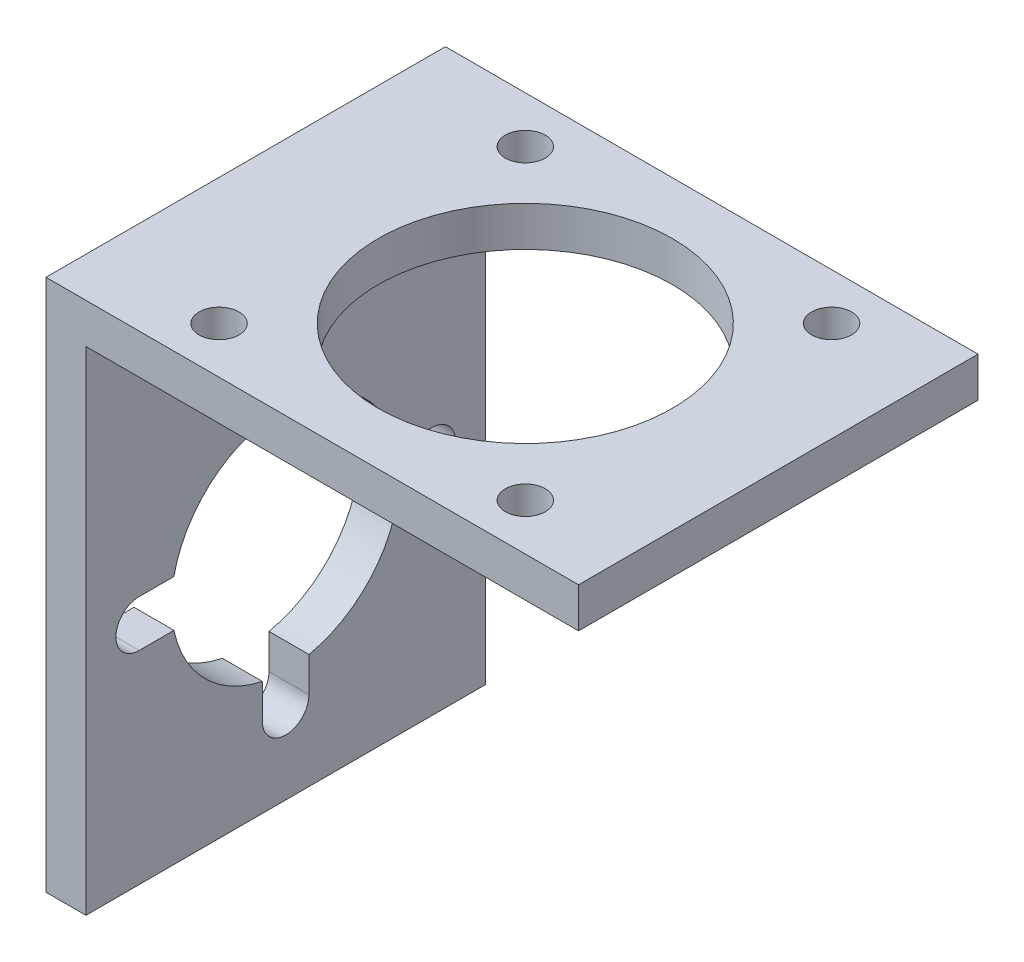
ISO-10303-21;
HEADER;
FILE_DESCRIPTION(('STEP AP214'),'2;1');
FILE_NAME('part.step','',(''),(''),'','','');
FILE_SCHEMA(('AUTOMOTIVE_DESIGN { 1 0 10303 214 1 1 1 1 }'));
ENDSEC;
DATA;
#1=APPLICATION_CONTEXT('core data for automotive mechanical design processes');
#2=APPLICATION_PROTOCOL_DEFINITION('international standard','automotive_design',2000,#1);
#3=PRODUCT_CONTEXT('',#1,'mechanical');
#4=PRODUCT('Part','Part','',(#3));
#5=PRODUCT_RELATED_PRODUCT_CATEGORY('part','',(#4));
#6=PRODUCT_DEFINITION_FORMATION('','',#4);
#7=PRODUCT_DEFINITION_CONTEXT('part definition',#1,'design');
#8=PRODUCT_DEFINITION('design','',#6,#7);
#9=PRODUCT_DEFINITION_SHAPE('','',#8);
#10=(LENGTH_UNIT() NAMED_UNIT(*) SI_UNIT(.MILLI.,.METRE.));
#11=(NAMED_UNIT(*) PLANE_ANGLE_UNIT() SI_UNIT($,.RADIAN.));
#12=(NAMED_UNIT(*) SI_UNIT($,.STERADIAN.) SOLID_ANGLE_UNIT());
#13=UNCERTAINTY_MEASURE_WITH_UNIT(LENGTH_MEASURE(1.E-05),#10,'distance_accuracy_value','');
#14=(GEOMETRIC_REPRESENTATION_CONTEXT(3) GLOBAL_UNCERTAINTY_ASSIGNED_CONTEXT((#13)) GLOBAL_UNIT_ASSIGNED_CONTEXT((#10,
#11,#12)) REPRESENTATION_CONTEXT('',''));
#15=CARTESIAN_POINT('',(0.,0.,0.));
#16=DIRECTION('',(0.,0.,1.));
#17=DIRECTION('',(1.,0.,0.));
#18=AXIS2_PLACEMENT_3D('',#15,#16,#17);
#19=CARTESIAN_POINT('',(3.,-3.,30.));
#20=DIRECTION('',(0.,1.,0.));
#21=DIRECTION('',(0.,0.,1.));
#22=AXIS2_PLACEMENT_3D('',#19,#20,#21);
#23=PLANE('',#22);
#24=CARTESIAN_POINT('',(9.50000000000012,-3.,26.5021834883641));
#25=DIRECTION('',(0.,-1.,0.));
#26=DIRECTION('',(0.,0.,-1.));
#27=AXIS2_PLACEMENT_3D('',#24,#25,#26);
#28=CIRCLE('',#27,1.5);
#29=CARTESIAN_POINT('',(9.50000000000012,-3.,25.0021834883641));
#30=VERTEX_POINT('',#29);
#31=EDGE_CURVE('E401',#30,#30,#28,.T.);
#32=ORIENTED_EDGE('',*,*,#31,.F.);
#33=EDGE_LOOP('',(#32));
#34=FACE_BOUND('',#33,.T.);
#35=CARTESIAN_POINT('',(9.49781651163593,-3.,3.49999999999975));
#36=DIRECTION('',(0.,-1.,0.));
#37=DIRECTION('',(0.,0.,-1.));
#38=AXIS2_PLACEMENT_3D('',#35,#36,#37);
#39=CIRCLE('',#38,1.5);
#40=CARTESIAN_POINT('',(9.49781651163593,-3.,1.99999999999976));
#41=VERTEX_POINT('',#40);
#42=EDGE_CURVE('E395',#41,#41,#39,.T.);
#43=ORIENTED_EDGE('',*,*,#42,.F.);
#44=EDGE_LOOP('',(#43));
#45=FACE_BOUND('',#44,.T.);
#46=CARTESIAN_POINT('',(32.5000000000003,-3.,3.49781651163567));
#47=DIRECTION('',(0.,-1.,0.));
#48=DIRECTION('',(0.,0.,-1.));
#49=AXIS2_PLACEMENT_3D('',#46,#47,#48);
#50=CIRCLE('',#49,1.49999999999999);
#51=CARTESIAN_POINT('',(32.5000000000003,-3.,1.99781651163568));
#52=VERTEX_POINT('',#51);
#53=EDGE_CURVE('E389',#52,#52,#50,.T.);
#54=ORIENTED_EDGE('',*,*,#53,.F.);
#55=EDGE_LOOP('',(#54));
#56=FACE_BOUND('',#55,.T.);
#57=CARTESIAN_POINT('',(32.5021834883643,-3.,26.5));
#58=DIRECTION('',(0.,-1.,0.));
#59=DIRECTION('',(0.,0.,-1.));
#60=AXIS2_PLACEMENT_3D('',#57,#58,#59);
#61=CIRCLE('',#60,1.49999999999999);
#62=CARTESIAN_POINT('',(32.5021834883643,-3.,25.));
#63=VERTEX_POINT('',#62);
#64=EDGE_CURVE('E383',#63,#63,#61,.T.);
#65=ORIENTED_EDGE('',*,*,#64,.F.);
#66=EDGE_LOOP('',(#65));
#67=FACE_BOUND('',#66,.T.);
#68=DIRECTION('',(1.,0.,0.));
#69=VECTOR('',#68,1.);
#70=CARTESIAN_POINT('',(3.,-3.,0.));
#71=LINE('',#70,#69);
#72=CARTESIAN_POINT('',(3.,-3.,0.));
#73=VERTEX_POINT('',#72);
#74=CARTESIAN_POINT('',(40.,-3.,0.));
#75=VERTEX_POINT('',#74);
#76=EDGE_CURVE('E279',#73,#75,#71,.T.);
#77=ORIENTED_EDGE('',*,*,#76,.T.);
#78=DIRECTION('',(0.,0.,-1.));
#79=VECTOR('',#78,1.);
#80=CARTESIAN_POINT('',(40.,-3.,30.));
#81=LINE('',#80,#79);
#82=CARTESIAN_POINT('',(40.,-3.,30.));
#83=VERTEX_POINT('',#82);
#84=EDGE_CURVE('E286',#83,#75,#81,.T.);
#85=ORIENTED_EDGE('',*,*,#84,.F.);
#86=DIRECTION('',(1.,0.,0.));
#87=VECTOR('',#86,1.);
#88=CARTESIAN_POINT('',(3.,-3.,30.));
#89=LINE('',#88,#87);
#90=CARTESIAN_POINT('',(3.,-3.,30.));
#91=VERTEX_POINT('',#90);
#92=EDGE_CURVE('E278',#91,#83,#89,.T.);
#93=ORIENTED_EDGE('',*,*,#92,.F.);
#94=DIRECTION('',(0.,0.,-1.));
#95=VECTOR('',#94,1.);
#96=CARTESIAN_POINT('',(3.,-3.,30.));
#97=LINE('',#96,#95);
#98=EDGE_CURVE('E290',#91,#73,#97,.T.);
#99=ORIENTED_EDGE('',*,*,#98,.T.);
#100=EDGE_LOOP('',(#77,#85,#93,#99));
#101=FACE_BOUND('',#100,.T.);
#102=CARTESIAN_POINT('',(21.,-3.,15.));
#103=DIRECTION('',(0.,-1.,0.));
#104=DIRECTION('',(0.,0.,-1.));
#105=AXIS2_PLACEMENT_3D('',#102,#103,#104);
#106=CIRCLE('',#105,11.05);
#107=CARTESIAN_POINT('',(21.,-3.,3.94999999999998));
#108=VERTEX_POINT('',#107);
#109=EDGE_CURVE('E375',#108,#108,#106,.T.);
#110=ORIENTED_EDGE('',*,*,#109,.F.);
#111=EDGE_LOOP('',(#110));
#112=FACE_BOUND('',#111,.T.);
#113=ADVANCED_FACE('F36',(#34,#45,#56,#67,#101,#112),#23,.F.);
#114=CARTESIAN_POINT('',(0.,-40.,0.));
#115=DIRECTION('',(0.,-1.,0.));
#116=DIRECTION('',(0.,0.,-1.));
#117=AXIS2_PLACEMENT_3D('',#114,#115,#116);
#118=PLANE('',#117);
#119=DIRECTION('',(0.,0.,-1.));
#120=VECTOR('',#119,1.);
#121=CARTESIAN_POINT('',(3.00000000000001,-40.,30.));
#122=LINE('',#121,#120);
#123=CARTESIAN_POINT('',(3.00000000000001,-40.,30.));
#124=VERTEX_POINT('',#123);
#125=CARTESIAN_POINT('',(3.00000000000001,-40.,0.));
#126=VERTEX_POINT('',#125);
#127=EDGE_CURVE('E282',#124,#126,#122,.T.);
#128=ORIENTED_EDGE('',*,*,#127,.F.);
#129=DIRECTION('',(1.,0.,0.));
#130=VECTOR('',#129,1.);
#131=CARTESIAN_POINT('',(0.,-40.,30.));
#132=LINE('',#131,#130);
#133=CARTESIAN_POINT('',(0.,-40.,30.));
#134=VERTEX_POINT('',#133);
#135=EDGE_CURVE('E289',#134,#124,#132,.T.);
#136=ORIENTED_EDGE('',*,*,#135,.F.);
#137=DIRECTION('',(0.,0.,1.));
#138=VECTOR('',#137,1.);
#139=CARTESIAN_POINT('',(0.,-40.,0.));
#140=LINE('',#139,#138);
#141=CARTESIAN_POINT('',(0.,-40.,0.));
#142=VERTEX_POINT('',#141);
#143=EDGE_CURVE('E315',#142,#134,#140,.T.);
#144=ORIENTED_EDGE('',*,*,#143,.F.);
#145=DIRECTION('',(1.,0.,0.));
#146=VECTOR('',#145,1.);
#147=CARTESIAN_POINT('',(0.,-40.,0.));
#148=LINE('',#147,#146);
#149=EDGE_CURVE('E293',#142,#126,#148,.T.);
#150=ORIENTED_EDGE('',*,*,#149,.T.);
#151=EDGE_LOOP('',(#128,#136,#144,#150));
#152=FACE_BOUND('',#151,.T.);
#153=ADVANCED_FACE('F38',(#152),#118,.T.);
#154=CARTESIAN_POINT('',(0.,0.,0.));
#155=DIRECTION('',(-1.,0.,0.));
#156=DIRECTION('',(0.,-1.,0.));
#157=AXIS2_PLACEMENT_3D('',#154,#155,#156);
#158=PLANE('',#157);
#159=CARTESIAN_POINT('',(0.,-12.02,14.9999999999999));
#160=DIRECTION('',(-1.,0.,0.));
#161=DIRECTION('',(0.,-1.,0.));
#162=AXIS2_PLACEMENT_3D('',#159,#160,#161);
#163=CIRCLE('',#162,1.75);
#164=CARTESIAN_POINT('',(0.,-12.02,16.7499999999999));
#165=VERTEX_POINT('',#164);
#166=CARTESIAN_POINT('',(0.,-12.02,13.2499999999999));
#167=VERTEX_POINT('',#166);
#168=EDGE_CURVE('E51',#165,#167,#163,.T.);
#169=ORIENTED_EDGE('',*,*,#168,.F.);
#170=DIRECTION('',(0.,1.,0.));
#171=VECTOR('',#170,1.);
#172=CARTESIAN_POINT('',(0.,-14.6305780890457,16.7499999999999));
#173=LINE('',#172,#171);
#174=CARTESIAN_POINT('',(0.,-14.6305780890457,16.7499999999999));
#175=VERTEX_POINT('',#174);
#176=EDGE_CURVE('E243',#175,#165,#173,.T.);
#177=ORIENTED_EDGE('',*,*,#176,.F.);
#178=CARTESIAN_POINT('',(0.,-23.02,15.));
#179=DIRECTION('',(-1.,0.,0.));
#180=DIRECTION('',(0.,-1.,0.));
#181=AXIS2_PLACEMENT_3D('',#178,#179,#180);
#182=CIRCLE('',#181,8.57);
#183=CARTESIAN_POINT('',(0.,-21.27,23.3894219109543));
#184=VERTEX_POINT('',#183);
#185=EDGE_CURVE('E240',#184,#175,#182,.T.);
#186=ORIENTED_EDGE('',*,*,#185,.F.);
#187=DIRECTION('',(0.,0.,-1.));
#188=VECTOR('',#187,1.);
#189=CARTESIAN_POINT('',(0.,-21.27,26.));
#190=LINE('',#189,#188);
#191=CARTESIAN_POINT('',(0.,-21.27,26.));
#192=VERTEX_POINT('',#191);
#193=EDGE_CURVE('E237',#192,#184,#190,.T.);
#194=ORIENTED_EDGE('',*,*,#193,.F.);
#195=CARTESIAN_POINT('',(0.,-23.02,26.));
#196=DIRECTION('',(-1.,0.,0.));
#197=DIRECTION('',(0.,-1.,0.));
#198=AXIS2_PLACEMENT_3D('',#195,#196,#197);
#199=CIRCLE('',#198,1.75);
#200=CARTESIAN_POINT('',(0.,-24.77,26.));
#201=VERTEX_POINT('',#200);
#202=EDGE_CURVE('E234',#201,#192,#199,.T.);
#203=ORIENTED_EDGE('',*,*,#202,.F.);
#204=DIRECTION('',(0.,0.,1.));
#205=VECTOR('',#204,1.);
#206=CARTESIAN_POINT('',(0.,-24.77,23.3894219109543));
#207=LINE('',#206,#205);
#208=CARTESIAN_POINT('',(0.,-24.77,23.3894219109543));
#209=VERTEX_POINT('',#208);
#210=EDGE_CURVE('E231',#209,#201,#207,.T.);
#211=ORIENTED_EDGE('',*,*,#210,.F.);
#212=CARTESIAN_POINT('',(0.,-23.02,15.));
#213=DIRECTION('',(-1.,0.,0.));
#214=DIRECTION('',(0.,-1.,0.));
#215=AXIS2_PLACEMENT_3D('',#212,#213,#214);
#216=CIRCLE('',#215,8.57);
#217=CARTESIAN_POINT('',(0.,-31.4094219109543,16.75));
#218=VERTEX_POINT('',#217);
#219=EDGE_CURVE('E228',#218,#209,#216,.T.);
#220=ORIENTED_EDGE('',*,*,#219,.F.);
#221=DIRECTION('',(0.,1.,0.));
#222=VECTOR('',#221,1.);
#223=CARTESIAN_POINT('',(0.,-34.02,16.75));
#224=LINE('',#223,#222);
#225=CARTESIAN_POINT('',(0.,-34.02,16.75));
#226=VERTEX_POINT('',#225);
#227=EDGE_CURVE('E225',#226,#218,#224,.T.);
#228=ORIENTED_EDGE('',*,*,#227,.F.);
#229=CARTESIAN_POINT('',(0.,-34.02,15.));
#230=DIRECTION('',(-1.,0.,0.));
#231=DIRECTION('',(0.,-1.,0.));
#232=AXIS2_PLACEMENT_3D('',#229,#230,#231);
#233=CIRCLE('',#232,1.75000000000002);
#234=CARTESIAN_POINT('',(0.,-34.02,13.25));
#235=VERTEX_POINT('',#234);
#236=EDGE_CURVE('E222',#235,#226,#233,.T.);
#237=ORIENTED_EDGE('',*,*,#236,.F.);
#238=DIRECTION('',(0.,-1.,0.));
#239=VECTOR('',#238,1.);
#240=CARTESIAN_POINT('',(0.,-31.4094219109543,13.2499999999999));
#241=LINE('',#240,#239);
#242=CARTESIAN_POINT('',(0.,-31.4094219109543,13.2499999999999));
#243=VERTEX_POINT('',#242);
#244=EDGE_CURVE('E219',#243,#235,#241,.T.);
#245=ORIENTED_EDGE('',*,*,#244,.F.);
#246=CARTESIAN_POINT('',(0.,-23.02,15.));
#247=DIRECTION('',(-1.,0.,0.));
#248=DIRECTION('',(0.,-1.,0.));
#249=AXIS2_PLACEMENT_3D('',#246,#247,#248);
#250=CIRCLE('',#249,8.57);
#251=CARTESIAN_POINT('',(0.,-24.7700000000001,6.61057808904573));
#252=VERTEX_POINT('',#251);
#253=EDGE_CURVE('E216',#252,#243,#250,.T.);
#254=ORIENTED_EDGE('',*,*,#253,.F.);
#255=DIRECTION('',(0.,0.,1.));
#256=VECTOR('',#255,1.);
#257=CARTESIAN_POINT('',(0.,-24.7700000000001,4.00000000000001));
#258=LINE('',#257,#256);
#259=CARTESIAN_POINT('',(0.,-24.7700000000001,4.00000000000001));
#260=VERTEX_POINT('',#259);
#261=EDGE_CURVE('E213',#260,#252,#258,.T.);
#262=ORIENTED_EDGE('',*,*,#261,.F.);
#263=CARTESIAN_POINT('',(0.,-23.0200000000001,4.00000000000001));
#264=DIRECTION('',(-1.,0.,0.));
#265=DIRECTION('',(0.,-1.,0.));
#266=AXIS2_PLACEMENT_3D('',#263,#264,#265);
#267=CIRCLE('',#266,1.75000000000004);
#268=CARTESIAN_POINT('',(0.,-21.2700000000001,4.00000000000001));
#269=VERTEX_POINT('',#268);
#270=EDGE_CURVE('E207',#269,#260,#267,.T.);
#271=ORIENTED_EDGE('',*,*,#270,.F.);
#272=DIRECTION('',(0.,0.,-1.));
#273=VECTOR('',#272,1.);
#274=CARTESIAN_POINT('',(0.,-21.27,6.61057808904571));
#275=LINE('',#274,#273);
#276=CARTESIAN_POINT('',(0.,-21.27,6.61057808904571));
#277=VERTEX_POINT('',#276);
#278=EDGE_CURVE('E205',#277,#269,#275,.T.);
#279=ORIENTED_EDGE('',*,*,#278,.F.);
#280=CARTESIAN_POINT('',(0.,-23.02,15.));
#281=DIRECTION('',(-1.,0.,0.));
#282=DIRECTION('',(0.,-1.,0.));
#283=AXIS2_PLACEMENT_3D('',#280,#281,#282);
#284=CIRCLE('',#283,8.57);
#285=CARTESIAN_POINT('',(0.,-14.6305780890457,13.2499999999999));
#286=VERTEX_POINT('',#285);
#287=EDGE_CURVE('E188',#286,#277,#284,.T.);
#288=ORIENTED_EDGE('',*,*,#287,.F.);
#289=DIRECTION('',(0.,-1.,0.));
#290=VECTOR('',#289,1.);
#291=CARTESIAN_POINT('',(0.,-12.02,13.2499999999999));
#292=LINE('',#291,#290);
#293=EDGE_CURVE('E197',#167,#286,#292,.T.);
#294=ORIENTED_EDGE('',*,*,#293,.F.);
#295=EDGE_LOOP('',(#169,#177,#186,#194,#203,#211,#220,#228,#237,#245,#254,#262,#271,#279,#288,#294));
#296=FACE_BOUND('',#295,.T.);
#297=DIRECTION('',(0.,-1.,0.));
#298=VECTOR('',#297,1.);
#299=CARTESIAN_POINT('',(0.,0.,30.));
#300=LINE('',#299,#298);
#301=CARTESIAN_POINT('',(0.,0.,30.));
#302=VERTEX_POINT('',#301);
#303=EDGE_CURVE('E297',#302,#134,#300,.T.);
#304=ORIENTED_EDGE('',*,*,#303,.F.);
#305=DIRECTION('',(0.,0.,1.));
#306=VECTOR('',#305,1.);
#307=CARTESIAN_POINT('',(0.,0.,0.));
#308=LINE('',#307,#306);
#309=CARTESIAN_POINT('',(0.,0.,0.));
#310=VERTEX_POINT('',#309);
#311=EDGE_CURVE('E318',#310,#302,#308,.T.);
#312=ORIENTED_EDGE('',*,*,#311,.F.);
#313=DIRECTION('',(0.,-1.,0.));
#314=VECTOR('',#313,1.);
#315=CARTESIAN_POINT('',(0.,0.,0.));
#316=LINE('',#315,#314);
#317=EDGE_CURVE('E302',#310,#142,#316,.T.);
#318=ORIENTED_EDGE('',*,*,#317,.T.);
#319=ORIENTED_EDGE('',*,*,#143,.T.);
#320=EDGE_LOOP('',(#304,#312,#318,#319));
#321=FACE_BOUND('',#320,.T.);
#322=ADVANCED_FACE('F201',(#296,#321),#158,.T.);
#323=CARTESIAN_POINT('',(40.,0.,0.));
#324=DIRECTION('',(0.,1.,0.));
#325=DIRECTION('',(0.,0.,1.));
#326=AXIS2_PLACEMENT_3D('',#323,#324,#325);
#327=PLANE('',#326);
#328=CARTESIAN_POINT('',(9.50000000000012,0.,26.5021834883641));
#329=DIRECTION('',(0.,-1.,0.));
#330=DIRECTION('',(0.,0.,-1.));
#331=AXIS2_PLACEMENT_3D('',#328,#329,#330);
#332=CIRCLE('',#331,1.5);
#333=CARTESIAN_POINT('',(9.50000000000012,0.,25.0021834883641));
#334=VERTEX_POINT('',#333);
#335=EDGE_CURVE('E398',#334,#334,#332,.T.);
#336=ORIENTED_EDGE('',*,*,#335,.T.);
#337=EDGE_LOOP('',(#336));
#338=FACE_BOUND('',#337,.T.);
#339=CARTESIAN_POINT('',(9.49781651163593,0.,3.49999999999975));
#340=DIRECTION('',(0.,-1.,0.));
#341=DIRECTION('',(0.,0.,-1.));
#342=AXIS2_PLACEMENT_3D('',#339,#340,#341);
#343=CIRCLE('',#342,1.5);
#344=CARTESIAN_POINT('',(9.49781651163593,0.,1.99999999999976));
#345=VERTEX_POINT('',#344);
#346=EDGE_CURVE('E392',#345,#345,#343,.T.);
#347=ORIENTED_EDGE('',*,*,#346,.T.);
#348=EDGE_LOOP('',(#347));
#349=FACE_BOUND('',#348,.T.);
#350=CARTESIAN_POINT('',(32.5000000000003,0.,3.49781651163567));
#351=DIRECTION('',(0.,-1.,0.));
#352=DIRECTION('',(0.,0.,-1.));
#353=AXIS2_PLACEMENT_3D('',#350,#351,#352);
#354=CIRCLE('',#353,1.49999999999999);
#355=CARTESIAN_POINT('',(32.5000000000003,0.,1.99781651163568));
#356=VERTEX_POINT('',#355);
#357=EDGE_CURVE('E386',#356,#356,#354,.T.);
#358=ORIENTED_EDGE('',*,*,#357,.T.);
#359=EDGE_LOOP('',(#358));
#360=FACE_BOUND('',#359,.T.);
#361=CARTESIAN_POINT('',(32.5021834883643,0.,26.5));
#362=DIRECTION('',(0.,-1.,0.));
#363=DIRECTION('',(0.,0.,-1.));
#364=AXIS2_PLACEMENT_3D('',#361,#362,#363);
#365=CIRCLE('',#364,1.49999999999999);
#366=CARTESIAN_POINT('',(32.5021834883643,0.,25.));
#367=VERTEX_POINT('',#366);
#368=EDGE_CURVE('E380',#367,#367,#365,.T.);
#369=ORIENTED_EDGE('',*,*,#368,.T.);
#370=EDGE_LOOP('',(#369));
#371=FACE_BOUND('',#370,.T.);
#372=CARTESIAN_POINT('',(21.,0.,15.));
#373=DIRECTION('',(0.,-1.,0.));
#374=DIRECTION('',(0.,0.,-1.));
#375=AXIS2_PLACEMENT_3D('',#372,#373,#374);
#376=CIRCLE('',#375,11.05);
#377=CARTESIAN_POINT('',(21.,0.,3.94999999999998));
#378=VERTEX_POINT('',#377);
#379=EDGE_CURVE('E373',#378,#378,#376,.T.);
#380=ORIENTED_EDGE('',*,*,#379,.T.);
#381=EDGE_LOOP('',(#380));
#382=FACE_BOUND('',#381,.T.);
#383=DIRECTION('',(-1.,0.,0.));
#384=VECTOR('',#383,1.);
#385=CARTESIAN_POINT('',(40.,0.,30.));
#386=LINE('',#385,#384);
#387=CARTESIAN_POINT('',(40.,0.,30.));
#388=VERTEX_POINT('',#387);
#389=EDGE_CURVE('E310',#388,#302,#386,.T.);
#390=ORIENTED_EDGE('',*,*,#389,.F.);
#391=DIRECTION('',(0.,0.,1.));
#392=VECTOR('',#391,1.);
#393=CARTESIAN_POINT('',(40.,0.,0.));
#394=LINE('',#393,#392);
#395=CARTESIAN_POINT('',(40.,0.,0.));
#396=VERTEX_POINT('',#395);
#397=EDGE_CURVE('E305',#396,#388,#394,.T.);
#398=ORIENTED_EDGE('',*,*,#397,.F.);
#399=DIRECTION('',(-1.,0.,0.));
#400=VECTOR('',#399,1.);
#401=CARTESIAN_POINT('',(40.,0.,0.));
#402=LINE('',#401,#400);
#403=EDGE_CURVE('E299',#396,#310,#402,.T.);
#404=ORIENTED_EDGE('',*,*,#403,.T.);
#405=ORIENTED_EDGE('',*,*,#311,.T.);
#406=EDGE_LOOP('',(#390,#398,#404,#405));
#407=FACE_BOUND('',#406,.T.);
#408=ADVANCED_FACE('F502',(#338,#349,#360,#371,#382,#407),#327,.T.);
#409=CARTESIAN_POINT('',(40.,-40.,0.));
#410=DIRECTION('',(1.,0.,0.));
#411=DIRECTION('',(0.,0.,-1.));
#412=AXIS2_PLACEMENT_3D('',#409,#410,#411);
#413=PLANE('',#412);
#414=ORIENTED_EDGE('',*,*,#84,.T.);
#415=DIRECTION('',(0.,1.,0.));
#416=VECTOR('',#415,1.);
#417=CARTESIAN_POINT('',(40.,-40.,0.));
#418=LINE('',#417,#416);
#419=EDGE_CURVE('E296',#75,#396,#418,.T.);
#420=ORIENTED_EDGE('',*,*,#419,.T.);
#421=ORIENTED_EDGE('',*,*,#397,.T.);
#422=DIRECTION('',(0.,1.,0.));
#423=VECTOR('',#422,1.);
#424=CARTESIAN_POINT('',(40.,-40.,30.));
#425=LINE('',#424,#423);
#426=EDGE_CURVE('E308',#83,#388,#425,.T.);
#427=ORIENTED_EDGE('',*,*,#426,.F.);
#428=EDGE_LOOP('',(#414,#420,#421,#427));
#429=FACE_BOUND('',#428,.T.);
#430=ADVANCED_FACE('F495',(#429),#413,.T.);
#431=CARTESIAN_POINT('',(0.,0.,0.));
#432=DIRECTION('',(0.,0.,1.));
#433=DIRECTION('',(1.,0.,0.));
#434=AXIS2_PLACEMENT_3D('',#431,#432,#433);
#435=PLANE('',#434);
#436=ORIENTED_EDGE('',*,*,#419,.F.);
#437=ORIENTED_EDGE('',*,*,#76,.F.);
#438=DIRECTION('',(0.,1.,0.));
#439=VECTOR('',#438,1.);
#440=CARTESIAN_POINT('',(3.00000000000001,-40.,0.));
#441=LINE('',#440,#439);
#442=EDGE_CURVE('E248',#126,#73,#441,.T.);
#443=ORIENTED_EDGE('',*,*,#442,.F.);
#444=ORIENTED_EDGE('',*,*,#149,.F.);
#445=ORIENTED_EDGE('',*,*,#317,.F.);
#446=ORIENTED_EDGE('',*,*,#403,.F.);
#447=EDGE_LOOP('',(#436,#437,#443,#444,#445,#446));
#448=FACE_BOUND('',#447,.T.);
#449=ADVANCED_FACE('F492',(#448),#435,.F.);
#450=CARTESIAN_POINT('',(0.,0.,30.));
#451=DIRECTION('',(0.,0.,1.));
#452=DIRECTION('',(1.,0.,0.));
#453=AXIS2_PLACEMENT_3D('',#450,#451,#452);
#454=PLANE('',#453);
#455=ORIENTED_EDGE('',*,*,#92,.T.);
#456=ORIENTED_EDGE('',*,*,#426,.T.);
#457=ORIENTED_EDGE('',*,*,#389,.T.);
#458=ORIENTED_EDGE('',*,*,#303,.T.);
#459=ORIENTED_EDGE('',*,*,#135,.T.);
#460=DIRECTION('',(0.,1.,0.));
#461=VECTOR('',#460,1.);
#462=CARTESIAN_POINT('',(3.00000000000001,-40.,30.));
#463=LINE('',#462,#461);
#464=EDGE_CURVE('E275',#124,#91,#463,.T.);
#465=ORIENTED_EDGE('',*,*,#464,.T.);
#466=EDGE_LOOP('',(#455,#456,#457,#458,#459,#465));
#467=FACE_BOUND('',#466,.T.);
#468=ADVANCED_FACE('F491',(#467),#454,.T.);
#469=CARTESIAN_POINT('',(3.00000000000001,-40.,30.));
#470=DIRECTION('',(-1.,0.,0.));
#471=DIRECTION('',(0.,-1.,0.));
#472=AXIS2_PLACEMENT_3D('',#469,#470,#471);
#473=PLANE('',#472);
#474=DIRECTION('',(0.,1.,0.));
#475=VECTOR('',#474,1.);
#476=CARTESIAN_POINT('',(3.00000000000001,-40.,16.7499999999999));
#477=LINE('',#476,#475);
#478=CARTESIAN_POINT('',(3.,-14.6305780890457,16.7499999999999));
#479=VERTEX_POINT('',#478);
#480=CARTESIAN_POINT('',(3.,-12.02,16.7499999999999));
#481=VERTEX_POINT('',#480);
#482=EDGE_CURVE('E44',#479,#481,#477,.T.);
#483=ORIENTED_EDGE('',*,*,#482,.T.);
#484=CARTESIAN_POINT('',(3.,-12.02,14.9999999999999));
#485=DIRECTION('',(-1.,0.,0.));
#486=DIRECTION('',(0.,-1.,0.));
#487=AXIS2_PLACEMENT_3D('',#484,#485,#486);
#488=CIRCLE('',#487,1.75);
#489=CARTESIAN_POINT('',(3.,-12.02,13.2499999999999));
#490=VERTEX_POINT('',#489);
#491=EDGE_CURVE('E11',#481,#490,#488,.T.);
#492=ORIENTED_EDGE('',*,*,#491,.T.);
#493=DIRECTION('',(0.,-1.,0.));
#494=VECTOR('',#493,1.);
#495=CARTESIAN_POINT('',(3.00000000000001,-40.,13.2499999999999));
#496=LINE('',#495,#494);
#497=CARTESIAN_POINT('',(3.,-14.6305780890457,13.2499999999999));
#498=VERTEX_POINT('',#497);
#499=EDGE_CURVE('E317',#490,#498,#496,.T.);
#500=ORIENTED_EDGE('',*,*,#499,.T.);
#501=CARTESIAN_POINT('',(3.,-23.02,15.));
#502=DIRECTION('',(-1.,0.,0.));
#503=DIRECTION('',(0.,-1.,0.));
#504=AXIS2_PLACEMENT_3D('',#501,#502,#503);
#505=CIRCLE('',#504,8.57);
#506=CARTESIAN_POINT('',(3.,-21.27,6.61057808904571));
#507=VERTEX_POINT('',#506);
#508=EDGE_CURVE('E191',#498,#507,#505,.T.);
#509=ORIENTED_EDGE('',*,*,#508,.T.);
#510=DIRECTION('',(0.,0.,-1.));
#511=VECTOR('',#510,1.);
#512=CARTESIAN_POINT('',(3.,-21.2699999999993,29.9999999999995));
#513=LINE('',#512,#511);
#514=CARTESIAN_POINT('',(3.,-21.2700000000001,4.00000000000001));
#515=VERTEX_POINT('',#514);
#516=EDGE_CURVE('E324',#507,#515,#513,.T.);
#517=ORIENTED_EDGE('',*,*,#516,.T.);
#518=CARTESIAN_POINT('',(3.,-23.0200000000001,4.00000000000001));
#519=DIRECTION('',(-1.,0.,0.));
#520=DIRECTION('',(0.,-1.,0.));
#521=AXIS2_PLACEMENT_3D('',#518,#519,#520);
#522=CIRCLE('',#521,1.75000000000004);
#523=CARTESIAN_POINT('',(3.,-24.7700000000001,4.00000000000001));
#524=VERTEX_POINT('',#523);
#525=EDGE_CURVE('E327',#515,#524,#522,.T.);
#526=ORIENTED_EDGE('',*,*,#525,.T.);
#527=DIRECTION('',(0.,0.,1.));
#528=VECTOR('',#527,1.);
#529=CARTESIAN_POINT('',(3.,-24.7700000000001,30.));
#530=LINE('',#529,#528);
#531=CARTESIAN_POINT('',(3.,-24.7700000000001,6.61057808904573));
#532=VERTEX_POINT('',#531);
#533=EDGE_CURVE('E330',#524,#532,#530,.T.);
#534=ORIENTED_EDGE('',*,*,#533,.T.);
#535=CARTESIAN_POINT('',(3.,-23.02,15.));
#536=DIRECTION('',(-1.,0.,0.));
#537=DIRECTION('',(0.,-1.,0.));
#538=AXIS2_PLACEMENT_3D('',#535,#536,#537);
#539=CIRCLE('',#538,8.57);
#540=CARTESIAN_POINT('',(3.,-31.4094219109543,13.2499999999999));
#541=VERTEX_POINT('',#540);
#542=EDGE_CURVE('E333',#532,#541,#539,.T.);
#543=ORIENTED_EDGE('',*,*,#542,.T.);
#544=DIRECTION('',(0.,-1.,0.));
#545=VECTOR('',#544,1.);
#546=CARTESIAN_POINT('',(3.00000000000001,-40.0000000000002,13.25));
#547=LINE('',#546,#545);
#548=CARTESIAN_POINT('',(3.,-34.02,13.25));
#549=VERTEX_POINT('',#548);
#550=EDGE_CURVE('E336',#541,#549,#547,.T.);
#551=ORIENTED_EDGE('',*,*,#550,.T.);
#552=CARTESIAN_POINT('',(3.,-34.02,15.));
#553=DIRECTION('',(-1.,0.,0.));
#554=DIRECTION('',(0.,-1.,0.));
#555=AXIS2_PLACEMENT_3D('',#552,#553,#554);
#556=CIRCLE('',#555,1.75000000000002);
#557=CARTESIAN_POINT('',(3.,-34.02,16.75));
#558=VERTEX_POINT('',#557);
#559=EDGE_CURVE('E339',#549,#558,#556,.T.);
#560=ORIENTED_EDGE('',*,*,#559,.T.);
#561=DIRECTION('',(0.,1.,0.));
#562=VECTOR('',#561,1.);
#563=CARTESIAN_POINT('',(3.00000000000001,-40.,16.75));
#564=LINE('',#563,#562);
#565=CARTESIAN_POINT('',(3.,-31.4094219109543,16.75));
#566=VERTEX_POINT('',#565);
#567=EDGE_CURVE('E342',#558,#566,#564,.T.);
#568=ORIENTED_EDGE('',*,*,#567,.T.);
#569=CARTESIAN_POINT('',(3.,-23.02,15.));
#570=DIRECTION('',(-1.,0.,0.));
#571=DIRECTION('',(0.,-1.,0.));
#572=AXIS2_PLACEMENT_3D('',#569,#570,#571);
#573=CIRCLE('',#572,8.57);
#574=CARTESIAN_POINT('',(3.,-24.77,23.3894219109543));
#575=VERTEX_POINT('',#574);
#576=EDGE_CURVE('E345',#566,#575,#573,.T.);
#577=ORIENTED_EDGE('',*,*,#576,.T.);
#578=DIRECTION('',(0.,0.,1.));
#579=VECTOR('',#578,1.);
#580=CARTESIAN_POINT('',(3.,-24.77,30.));
#581=LINE('',#580,#579);
#582=CARTESIAN_POINT('',(3.,-24.77,26.));
#583=VERTEX_POINT('',#582);
#584=EDGE_CURVE('E348',#575,#583,#581,.T.);
#585=ORIENTED_EDGE('',*,*,#584,.T.);
#586=CARTESIAN_POINT('',(3.,-23.02,26.));
#587=DIRECTION('',(-1.,0.,0.));
#588=DIRECTION('',(0.,-1.,0.));
#589=AXIS2_PLACEMENT_3D('',#586,#587,#588);
#590=CIRCLE('',#589,1.75);
#591=CARTESIAN_POINT('',(3.,-21.27,26.));
#592=VERTEX_POINT('',#591);
#593=EDGE_CURVE('E351',#583,#592,#590,.T.);
#594=ORIENTED_EDGE('',*,*,#593,.T.);
#595=DIRECTION('',(0.,0.,-1.));
#596=VECTOR('',#595,1.);
#597=CARTESIAN_POINT('',(3.,-21.27,30.));
#598=LINE('',#597,#596);
#599=CARTESIAN_POINT('',(3.,-21.27,23.3894219109543));
#600=VERTEX_POINT('',#599);
#601=EDGE_CURVE('E354',#592,#600,#598,.T.);
#602=ORIENTED_EDGE('',*,*,#601,.T.);
#603=CARTESIAN_POINT('',(3.,-23.02,15.));
#604=DIRECTION('',(-1.,0.,0.));
#605=DIRECTION('',(0.,-1.,0.));
#606=AXIS2_PLACEMENT_3D('',#603,#604,#605);
#607=CIRCLE('',#606,8.57);
#608=EDGE_CURVE('E357',#600,#479,#607,.T.);
#609=ORIENTED_EDGE('',*,*,#608,.T.);
#610=EDGE_LOOP('',(#483,#492,#500,#509,#517,#526,#534,#543,#551,#560,#568,#577,#585,#594,#602,#609));
#611=FACE_BOUND('',#610,.T.);
#612=ORIENTED_EDGE('',*,*,#442,.T.);
#613=ORIENTED_EDGE('',*,*,#98,.F.);
#614=ORIENTED_EDGE('',*,*,#464,.F.);
#615=ORIENTED_EDGE('',*,*,#127,.T.);
#616=EDGE_LOOP('',(#612,#613,#614,#615));
#617=FACE_BOUND('',#616,.T.);
#618=ADVANCED_FACE('F361',(#611,#617),#473,.F.);
#619=CARTESIAN_POINT('',(40.,-12.02,14.9999999999999));
#620=DIRECTION('',(-1.,0.,0.));
#621=DIRECTION('',(0.,-1.,0.));
#622=AXIS2_PLACEMENT_3D('',#619,#620,#621);
#623=CYLINDRICAL_SURFACE('',#622,1.75);
#624=DIRECTION('',(-1.,0.,0.));
#625=VECTOR('',#624,1.);
#626=CARTESIAN_POINT('',(40.,-12.02,16.7499999999999));
#627=LINE('',#626,#625);
#628=EDGE_CURVE('E246',#481,#165,#627,.T.);
#629=ORIENTED_EDGE('',*,*,#628,.T.);
#630=ORIENTED_EDGE('',*,*,#168,.T.);
#631=DIRECTION('',(-1.,0.,0.));
#632=VECTOR('',#631,1.);
#633=CARTESIAN_POINT('',(40.,-12.02,13.2499999999999));
#634=LINE('',#633,#632);
#635=EDGE_CURVE('E194',#490,#167,#634,.T.);
#636=ORIENTED_EDGE('',*,*,#635,.F.);
#637=ORIENTED_EDGE('',*,*,#491,.F.);
#638=EDGE_LOOP('',(#629,#630,#636,#637));
#639=FACE_BOUND('',#638,.T.);
#640=ADVANCED_FACE('F438',(#639),#623,.F.);
#641=CARTESIAN_POINT('',(40.,-14.6305780890457,16.7499999999999));
#642=DIRECTION('',(0.,0.,1.));
#643=DIRECTION('',(0.,-1.,0.));
#644=AXIS2_PLACEMENT_3D('',#641,#642,#643);
#645=PLANE('',#644);
#646=DIRECTION('',(-1.,0.,0.));
#647=VECTOR('',#646,1.);
#648=CARTESIAN_POINT('',(40.,-14.6305780890457,16.7499999999999));
#649=LINE('',#648,#647);
#650=EDGE_CURVE('E249',#479,#175,#649,.T.);
#651=ORIENTED_EDGE('',*,*,#650,.T.);
#652=ORIENTED_EDGE('',*,*,#176,.T.);
#653=ORIENTED_EDGE('',*,*,#628,.F.);
#654=ORIENTED_EDGE('',*,*,#482,.F.);
#655=EDGE_LOOP('',(#651,#652,#653,#654));
#656=FACE_BOUND('',#655,.T.);
#657=ADVANCED_FACE('F366',(#656),#645,.F.);
#658=CARTESIAN_POINT('',(40.,-23.02,15.));
#659=DIRECTION('',(-1.,0.,0.));
#660=DIRECTION('',(0.,-1.,0.));
#661=AXIS2_PLACEMENT_3D('',#658,#659,#660);
#662=CYLINDRICAL_SURFACE('',#661,8.57);
#663=DIRECTION('',(-1.,0.,0.));
#664=VECTOR('',#663,1.);
#665=CARTESIAN_POINT('',(40.,-21.27,23.3894219109543));
#666=LINE('',#665,#664);
#667=EDGE_CURVE('E251',#600,#184,#666,.T.);
#668=ORIENTED_EDGE('',*,*,#667,.T.);
#669=ORIENTED_EDGE('',*,*,#185,.T.);
#670=ORIENTED_EDGE('',*,*,#650,.F.);
#671=ORIENTED_EDGE('',*,*,#608,.F.);
#672=EDGE_LOOP('',(#668,#669,#670,#671));
#673=FACE_BOUND('',#672,.T.);
#674=ADVANCED_FACE('F368',(#673),#662,.F.);
#675=CARTESIAN_POINT('',(40.,-21.27,26.));
#676=DIRECTION('',(0.,1.,0.));
#677=DIRECTION('',(-1.,0.,0.));
#678=AXIS2_PLACEMENT_3D('',#675,#676,#677);
#679=PLANE('',#678);
#680=DIRECTION('',(-1.,0.,0.));
#681=VECTOR('',#680,1.);
#682=CARTESIAN_POINT('',(40.,-21.27,26.));
#683=LINE('',#682,#681);
#684=EDGE_CURVE('E253',#592,#192,#683,.T.);
#685=ORIENTED_EDGE('',*,*,#684,.T.);
#686=ORIENTED_EDGE('',*,*,#193,.T.);
#687=ORIENTED_EDGE('',*,*,#667,.F.);
#688=ORIENTED_EDGE('',*,*,#601,.F.);
#689=EDGE_LOOP('',(#685,#686,#687,#688));
#690=FACE_BOUND('',#689,.T.);
#691=ADVANCED_FACE('F441',(#690),#679,.F.);
#692=CARTESIAN_POINT('',(40.,-23.02,26.));
#693=DIRECTION('',(-1.,0.,0.));
#694=DIRECTION('',(0.,-1.,0.));
#695=AXIS2_PLACEMENT_3D('',#692,#693,#694);
#696=CYLINDRICAL_SURFACE('',#695,1.75);
#697=DIRECTION('',(-1.,0.,0.));
#698=VECTOR('',#697,1.);
#699=CARTESIAN_POINT('',(40.,-24.77,26.));
#700=LINE('',#699,#698);
#701=EDGE_CURVE('E255',#583,#201,#700,.T.);
#702=ORIENTED_EDGE('',*,*,#701,.T.);
#703=ORIENTED_EDGE('',*,*,#202,.T.);
#704=ORIENTED_EDGE('',*,*,#684,.F.);
#705=ORIENTED_EDGE('',*,*,#593,.F.);
#706=EDGE_LOOP('',(#702,#703,#704,#705));
#707=FACE_BOUND('',#706,.T.);
#708=ADVANCED_FACE('F444',(#707),#696,.F.);
#709=CARTESIAN_POINT('',(40.,-24.77,23.3894219109543));
#710=DIRECTION('',(0.,-1.,0.));
#711=DIRECTION('',(1.,0.,0.));
#712=AXIS2_PLACEMENT_3D('',#709,#710,#711);
#713=PLANE('',#712);
#714=DIRECTION('',(-1.,0.,0.));
#715=VECTOR('',#714,1.);
#716=CARTESIAN_POINT('',(40.,-24.77,23.3894219109543));
#717=LINE('',#716,#715);
#718=EDGE_CURVE('E257',#575,#209,#717,.T.);
#719=ORIENTED_EDGE('',*,*,#718,.T.);
#720=ORIENTED_EDGE('',*,*,#210,.T.);
#721=ORIENTED_EDGE('',*,*,#701,.F.);
#722=ORIENTED_EDGE('',*,*,#584,.F.);
#723=EDGE_LOOP('',(#719,#720,#721,#722));
#724=FACE_BOUND('',#723,.T.);
#725=ADVANCED_FACE('F448',(#724),#713,.F.);
#726=CARTESIAN_POINT('',(40.,-23.02,15.));
#727=DIRECTION('',(-1.,0.,0.));
#728=DIRECTION('',(0.,-1.,0.));
#729=AXIS2_PLACEMENT_3D('',#726,#727,#728);
#730=CYLINDRICAL_SURFACE('',#729,8.57);
#731=DIRECTION('',(-1.,0.,0.));
#732=VECTOR('',#731,1.);
#733=CARTESIAN_POINT('',(40.,-31.4094219109543,16.75));
#734=LINE('',#733,#732);
#735=EDGE_CURVE('E259',#566,#218,#734,.T.);
#736=ORIENTED_EDGE('',*,*,#735,.T.);
#737=ORIENTED_EDGE('',*,*,#219,.T.);
#738=ORIENTED_EDGE('',*,*,#718,.F.);
#739=ORIENTED_EDGE('',*,*,#576,.F.);
#740=EDGE_LOOP('',(#736,#737,#738,#739));
#741=FACE_BOUND('',#740,.T.);
#742=ADVANCED_FACE('F452',(#741),#730,.F.);
#743=CARTESIAN_POINT('',(40.,-34.02,16.75));
#744=DIRECTION('',(0.,0.,1.));
#745=DIRECTION('',(1.,0.,0.));
#746=AXIS2_PLACEMENT_3D('',#743,#744,#745);
#747=PLANE('',#746);
#748=DIRECTION('',(-1.,0.,0.));
#749=VECTOR('',#748,1.);
#750=CARTESIAN_POINT('',(40.,-34.02,16.75));
#751=LINE('',#750,#749);
#752=EDGE_CURVE('E261',#558,#226,#751,.T.);
#753=ORIENTED_EDGE('',*,*,#752,.T.);
#754=ORIENTED_EDGE('',*,*,#227,.T.);
#755=ORIENTED_EDGE('',*,*,#735,.F.);
#756=ORIENTED_EDGE('',*,*,#567,.F.);
#757=EDGE_LOOP('',(#753,#754,#755,#756));
#758=FACE_BOUND('',#757,.T.);
#759=ADVANCED_FACE('F456',(#758),#747,.F.);
#760=CARTESIAN_POINT('',(40.,-34.02,15.));
#761=DIRECTION('',(-1.,0.,0.));
#762=DIRECTION('',(0.,-1.,0.));
#763=AXIS2_PLACEMENT_3D('',#760,#761,#762);
#764=CYLINDRICAL_SURFACE('',#763,1.75000000000002);
#765=DIRECTION('',(-1.,0.,0.));
#766=VECTOR('',#765,1.);
#767=CARTESIAN_POINT('',(40.,-34.02,13.25));
#768=LINE('',#767,#766);
#769=EDGE_CURVE('E263',#549,#235,#768,.T.);
#770=ORIENTED_EDGE('',*,*,#769,.T.);
#771=ORIENTED_EDGE('',*,*,#236,.T.);
#772=ORIENTED_EDGE('',*,*,#752,.F.);
#773=ORIENTED_EDGE('',*,*,#559,.F.);
#774=EDGE_LOOP('',(#770,#771,#772,#773));
#775=FACE_BOUND('',#774,.T.);
#776=ADVANCED_FACE('F460',(#775),#764,.F.);
#777=CARTESIAN_POINT('',(40.,-31.4094219109543,13.2499999999999));
#778=DIRECTION('',(0.,0.,-1.));
#779=DIRECTION('',(0.,1.,0.));
#780=AXIS2_PLACEMENT_3D('',#777,#778,#779);
#781=PLANE('',#780);
#782=DIRECTION('',(-1.,0.,0.));
#783=VECTOR('',#782,1.);
#784=CARTESIAN_POINT('',(40.,-31.4094219109543,13.2499999999999));
#785=LINE('',#784,#783);
#786=EDGE_CURVE('E265',#541,#243,#785,.T.);
#787=ORIENTED_EDGE('',*,*,#786,.T.);
#788=ORIENTED_EDGE('',*,*,#244,.T.);
#789=ORIENTED_EDGE('',*,*,#769,.F.);
#790=ORIENTED_EDGE('',*,*,#550,.F.);
#791=EDGE_LOOP('',(#787,#788,#789,#790));
#792=FACE_BOUND('',#791,.T.);
#793=ADVANCED_FACE('F464',(#792),#781,.F.);
#794=CARTESIAN_POINT('',(40.,-23.02,15.));
#795=DIRECTION('',(-1.,0.,0.));
#796=DIRECTION('',(0.,-1.,0.));
#797=AXIS2_PLACEMENT_3D('',#794,#795,#796);
#798=CYLINDRICAL_SURFACE('',#797,8.57);
#799=DIRECTION('',(-1.,0.,0.));
#800=VECTOR('',#799,1.);
#801=CARTESIAN_POINT('',(40.,-24.7700000000001,6.61057808904573));
#802=LINE('',#801,#800);
#803=EDGE_CURVE('E267',#532,#252,#802,.T.);
#804=ORIENTED_EDGE('',*,*,#803,.T.);
#805=ORIENTED_EDGE('',*,*,#253,.T.);
#806=ORIENTED_EDGE('',*,*,#786,.F.);
#807=ORIENTED_EDGE('',*,*,#542,.F.);
#808=EDGE_LOOP('',(#804,#805,#806,#807));
#809=FACE_BOUND('',#808,.T.);
#810=ADVANCED_FACE('F468',(#809),#798,.F.);
#811=CARTESIAN_POINT('',(40.,-24.7700000000001,4.00000000000001));
#812=DIRECTION('',(0.,-1.,0.));
#813=DIRECTION('',(1.,0.,0.));
#814=AXIS2_PLACEMENT_3D('',#811,#812,#813);
#815=PLANE('',#814);
#816=DIRECTION('',(-1.,0.,0.));
#817=VECTOR('',#816,1.);
#818=CARTESIAN_POINT('',(40.,-24.7700000000001,4.00000000000001));
#819=LINE('',#818,#817);
#820=EDGE_CURVE('E269',#524,#260,#819,.T.);
#821=ORIENTED_EDGE('',*,*,#820,.T.);
#822=ORIENTED_EDGE('',*,*,#261,.T.);
#823=ORIENTED_EDGE('',*,*,#803,.F.);
#824=ORIENTED_EDGE('',*,*,#533,.F.);
#825=EDGE_LOOP('',(#821,#822,#823,#824));
#826=FACE_BOUND('',#825,.T.);
#827=ADVANCED_FACE('F472',(#826),#815,.F.);
#828=CARTESIAN_POINT('',(40.,-23.0200000000001,4.00000000000001));
#829=DIRECTION('',(-1.,0.,0.));
#830=DIRECTION('',(0.,-1.,0.));
#831=AXIS2_PLACEMENT_3D('',#828,#829,#830);
#832=CYLINDRICAL_SURFACE('',#831,1.75000000000004);
#833=DIRECTION('',(-1.,0.,0.));
#834=VECTOR('',#833,1.);
#835=CARTESIAN_POINT('',(40.,-21.2700000000001,4.00000000000001));
#836=LINE('',#835,#834);
#837=EDGE_CURVE('E271',#515,#269,#836,.T.);
#838=ORIENTED_EDGE('',*,*,#837,.T.);
#839=ORIENTED_EDGE('',*,*,#270,.T.);
#840=ORIENTED_EDGE('',*,*,#820,.F.);
#841=ORIENTED_EDGE('',*,*,#525,.F.);
#842=EDGE_LOOP('',(#838,#839,#840,#841));
#843=FACE_BOUND('',#842,.T.);
#844=ADVANCED_FACE('F476',(#843),#832,.F.);
#845=CARTESIAN_POINT('',(40.,-21.27,6.61057808904571));
#846=DIRECTION('',(0.,1.,0.));
#847=DIRECTION('',(0.,0.,1.));
#848=AXIS2_PLACEMENT_3D('',#845,#846,#847);
#849=PLANE('',#848);
#850=DIRECTION('',(-1.,0.,0.));
#851=VECTOR('',#850,1.);
#852=CARTESIAN_POINT('',(40.,-21.27,6.61057808904571));
#853=LINE('',#852,#851);
#854=EDGE_CURVE('E193',#507,#277,#853,.T.);
#855=ORIENTED_EDGE('',*,*,#854,.T.);
#856=ORIENTED_EDGE('',*,*,#278,.T.);
#857=ORIENTED_EDGE('',*,*,#837,.F.);
#858=ORIENTED_EDGE('',*,*,#516,.F.);
#859=EDGE_LOOP('',(#855,#856,#857,#858));
#860=FACE_BOUND('',#859,.T.);
#861=ADVANCED_FACE('F480',(#860),#849,.F.);
#862=CARTESIAN_POINT('',(40.,-23.02,15.));
#863=DIRECTION('',(-1.,0.,0.));
#864=DIRECTION('',(0.,-1.,0.));
#865=AXIS2_PLACEMENT_3D('',#862,#863,#864);
#866=CYLINDRICAL_SURFACE('',#865,8.57);
#867=DIRECTION('',(-1.,0.,0.));
#868=VECTOR('',#867,1.);
#869=CARTESIAN_POINT('',(40.,-14.6305780890457,13.2499999999999));
#870=LINE('',#869,#868);
#871=EDGE_CURVE('E59',#498,#286,#870,.T.);
#872=ORIENTED_EDGE('',*,*,#871,.T.);
#873=ORIENTED_EDGE('',*,*,#287,.T.);
#874=ORIENTED_EDGE('',*,*,#854,.F.);
#875=ORIENTED_EDGE('',*,*,#508,.F.);
#876=EDGE_LOOP('',(#872,#873,#874,#875));
#877=FACE_BOUND('',#876,.T.);
#878=ADVANCED_FACE('F185',(#877),#866,.F.);
#879=CARTESIAN_POINT('',(40.,-12.02,13.2499999999999));
#880=DIRECTION('',(0.,0.,-1.));
#881=DIRECTION('',(-1.,0.,0.));
#882=AXIS2_PLACEMENT_3D('',#879,#880,#881);
#883=PLANE('',#882);
#884=ORIENTED_EDGE('',*,*,#635,.T.);
#885=ORIENTED_EDGE('',*,*,#293,.T.);
#886=ORIENTED_EDGE('',*,*,#871,.F.);
#887=ORIENTED_EDGE('',*,*,#499,.F.);
#888=EDGE_LOOP('',(#884,#885,#886,#887));
#889=FACE_BOUND('',#888,.T.);
#890=ADVANCED_FACE('F198',(#889),#883,.F.);
#891=CARTESIAN_POINT('',(21.,-3.,15.));
#892=DIRECTION('',(0.,-1.,0.));
#893=DIRECTION('',(0.,0.,-1.));
#894=AXIS2_PLACEMENT_3D('',#891,#892,#893);
#895=CYLINDRICAL_SURFACE('',#894,11.05);
#896=ORIENTED_EDGE('',*,*,#379,.F.);
#897=EDGE_LOOP('',(#896));
#898=FACE_BOUND('',#897,.T.);
#899=ORIENTED_EDGE('',*,*,#109,.T.);
#900=EDGE_LOOP('',(#899));
#901=FACE_BOUND('',#900,.T.);
#902=ADVANCED_FACE('F420',(#898,#901),#895,.F.);
#903=CARTESIAN_POINT('',(32.5021834883643,-3.,26.5));
#904=DIRECTION('',(0.,-1.,0.));
#905=DIRECTION('',(0.,0.,-1.));
#906=AXIS2_PLACEMENT_3D('',#903,#904,#905);
#907=CYLINDRICAL_SURFACE('',#906,1.49999999999999);
#908=ORIENTED_EDGE('',*,*,#368,.F.);
#909=EDGE_LOOP('',(#908));
#910=FACE_BOUND('',#909,.T.);
#911=ORIENTED_EDGE('',*,*,#64,.T.);
#912=EDGE_LOOP('',(#911));
#913=FACE_BOUND('',#912,.T.);
#914=ADVANCED_FACE('F422',(#910,#913),#907,.F.);
#915=CARTESIAN_POINT('',(32.5000000000003,-3.,3.49781651163567));
#916=DIRECTION('',(0.,-1.,0.));
#917=DIRECTION('',(0.,0.,-1.));
#918=AXIS2_PLACEMENT_3D('',#915,#916,#917);
#919=CYLINDRICAL_SURFACE('',#918,1.49999999999999);
#920=ORIENTED_EDGE('',*,*,#357,.F.);
#921=EDGE_LOOP('',(#920));
#922=FACE_BOUND('',#921,.T.);
#923=ORIENTED_EDGE('',*,*,#53,.T.);
#924=EDGE_LOOP('',(#923));
#925=FACE_BOUND('',#924,.T.);
#926=ADVANCED_FACE('F429',(#922,#925),#919,.F.);
#927=CARTESIAN_POINT('',(9.49781651163593,-3.,3.49999999999975));
#928=DIRECTION('',(0.,-1.,0.));
#929=DIRECTION('',(0.,0.,-1.));
#930=AXIS2_PLACEMENT_3D('',#927,#928,#929);
#931=CYLINDRICAL_SURFACE('',#930,1.5);
#932=ORIENTED_EDGE('',*,*,#346,.F.);
#933=EDGE_LOOP('',(#932));
#934=FACE_BOUND('',#933,.T.);
#935=ORIENTED_EDGE('',*,*,#42,.T.);
#936=EDGE_LOOP('',(#935));
#937=FACE_BOUND('',#936,.T.);
#938=ADVANCED_FACE('F557',(#934,#937),#931,.F.);
#939=CARTESIAN_POINT('',(9.50000000000012,-3.,26.5021834883641));
#940=DIRECTION('',(0.,-1.,0.));
#941=DIRECTION('',(0.,0.,-1.));
#942=AXIS2_PLACEMENT_3D('',#939,#940,#941);
#943=CYLINDRICAL_SURFACE('',#942,1.5);
#944=ORIENTED_EDGE('',*,*,#335,.F.);
#945=EDGE_LOOP('',(#944));
#946=FACE_BOUND('',#945,.T.);
#947=ORIENTED_EDGE('',*,*,#31,.T.);
#948=EDGE_LOOP('',(#947));
#949=FACE_BOUND('',#948,.T.);
#950=ADVANCED_FACE('F405',(#946,#949),#943,.F.);
#951=CLOSED_SHELL('',(#113,#153,#322,#408,#430,#449,#468,#618,#640,#657,#674,#691,#708,#725,
#742,#759,#776,#793,#810,#827,#844,#861,#878,#890,#902,#914,#926,#938,#950));
#952=MANIFOLD_SOLID_BREP('B2',#951);
#953=ADVANCED_BREP_SHAPE_REPRESENTATION('',(#18,#952),#14);
#954=SHAPE_DEFINITION_REPRESENTATION(#9,#953);
ENDSEC;
END-ISO-10303-21;
